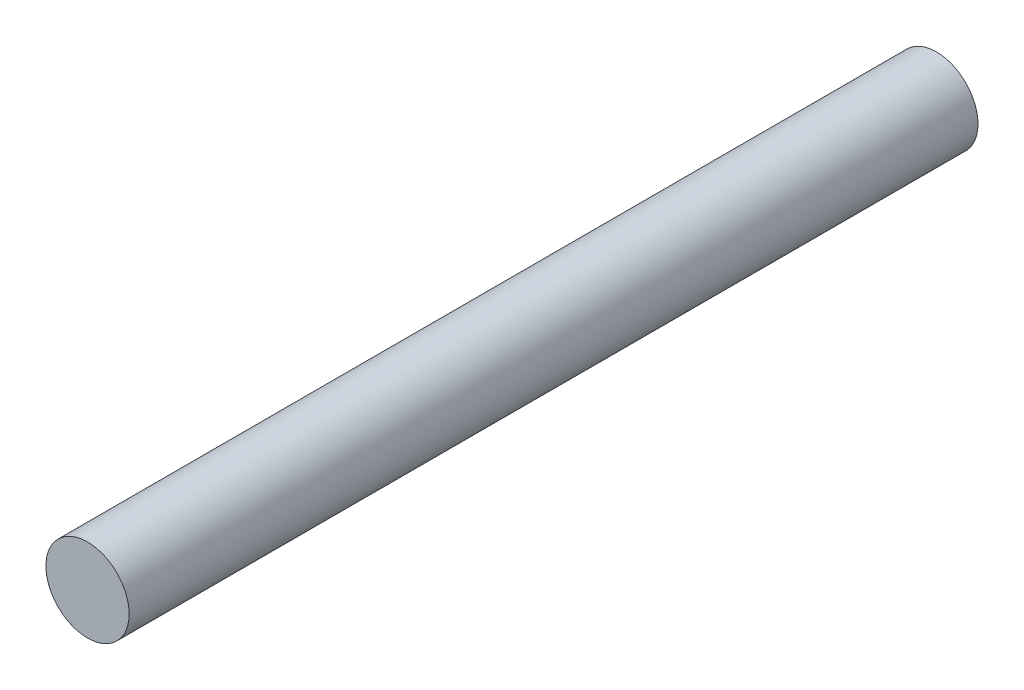
ISO-10303-21;
HEADER;
FILE_DESCRIPTION(('STEP AP214'),'2;1');
FILE_NAME('part.step','',(''),(''),'','','');
FILE_SCHEMA(('AUTOMOTIVE_DESIGN { 1 0 10303 214 1 1 1 1 }'));
ENDSEC;
DATA;
#1=APPLICATION_CONTEXT('core data for automotive mechanical design processes');
#2=APPLICATION_PROTOCOL_DEFINITION('international standard','automotive_design',2000,#1);
#3=PRODUCT_CONTEXT('',#1,'mechanical');
#4=PRODUCT('Part','Part','',(#3));
#5=PRODUCT_RELATED_PRODUCT_CATEGORY('part','',(#4));
#6=PRODUCT_DEFINITION_FORMATION('','',#4);
#7=PRODUCT_DEFINITION_CONTEXT('part definition',#1,'design');
#8=PRODUCT_DEFINITION('design','',#6,#7);
#9=PRODUCT_DEFINITION_SHAPE('','',#8);
#10=(LENGTH_UNIT() NAMED_UNIT(*) SI_UNIT(.MILLI.,.METRE.));
#11=(NAMED_UNIT(*) PLANE_ANGLE_UNIT() SI_UNIT($,.RADIAN.));
#12=(NAMED_UNIT(*) SI_UNIT($,.STERADIAN.) SOLID_ANGLE_UNIT());
#13=UNCERTAINTY_MEASURE_WITH_UNIT(LENGTH_MEASURE(1.E-05),#10,'distance_accuracy_value','');
#14=(GEOMETRIC_REPRESENTATION_CONTEXT(3) GLOBAL_UNCERTAINTY_ASSIGNED_CONTEXT((#13)) GLOBAL_UNIT_ASSIGNED_CONTEXT((#10,
#11,#12)) REPRESENTATION_CONTEXT('',''));
#15=CARTESIAN_POINT('',(0.,0.,0.));
#16=DIRECTION('',(0.,0.,1.));
#17=DIRECTION('',(1.,0.,0.));
#18=AXIS2_PLACEMENT_3D('',#15,#16,#17);
#19=CARTESIAN_POINT('',(0.,0.,204.));
#20=DIRECTION('',(0.,0.,-1.));
#21=DIRECTION('',(-1.,0.,0.));
#22=AXIS2_PLACEMENT_3D('',#19,#20,#21);
#23=CYLINDRICAL_SURFACE('',#22,10.);
#24=CARTESIAN_POINT('',(0.,0.,204.));
#25=DIRECTION('',(0.,0.,1.));
#26=DIRECTION('',(1.,0.,0.));
#27=AXIS2_PLACEMENT_3D('',#24,#25,#26);
#28=CIRCLE('',#27,10.);
#29=CARTESIAN_POINT('',(10.,0.,204.));
#30=VERTEX_POINT('',#29);
#31=EDGE_CURVE('E10',#30,#30,#28,.T.);
#32=ORIENTED_EDGE('',*,*,#31,.F.);
#33=EDGE_LOOP('',(#32));
#34=FACE_BOUND('',#33,.T.);
#35=CARTESIAN_POINT('',(0.,0.,0.));
#36=DIRECTION('',(0.,0.,1.));
#37=DIRECTION('',(1.,0.,0.));
#38=AXIS2_PLACEMENT_3D('',#35,#36,#37);
#39=CIRCLE('',#38,10.);
#40=CARTESIAN_POINT('',(10.,0.,0.));
#41=VERTEX_POINT('',#40);
#42=EDGE_CURVE('E33',#41,#41,#39,.T.);
#43=ORIENTED_EDGE('',*,*,#42,.T.);
#44=EDGE_LOOP('',(#43));
#45=FACE_BOUND('',#44,.T.);
#46=ADVANCED_FACE('F30',(#34,#45),#23,.T.);
#47=CARTESIAN_POINT('',(0.,0.,204.));
#48=DIRECTION('',(0.,0.,1.));
#49=DIRECTION('',(1.,0.,0.));
#50=AXIS2_PLACEMENT_3D('',#47,#48,#49);
#51=PLANE('',#50);
#52=ORIENTED_EDGE('',*,*,#31,.T.);
#53=EDGE_LOOP('',(#52));
#54=FACE_BOUND('',#53,.T.);
#55=ADVANCED_FACE('F45',(#54),#51,.T.);
#56=CARTESIAN_POINT('',(0.,0.,0.));
#57=DIRECTION('',(0.,0.,1.));
#58=DIRECTION('',(1.,0.,0.));
#59=AXIS2_PLACEMENT_3D('',#56,#57,#58);
#60=PLANE('',#59);
#61=ORIENTED_EDGE('',*,*,#42,.F.);
#62=EDGE_LOOP('',(#61));
#63=FACE_BOUND('',#62,.T.);
#64=ADVANCED_FACE('F43',(#63),#60,.F.);
#65=CLOSED_SHELL('',(#46,#55,#64));
#66=MANIFOLD_SOLID_BREP('B2',#65);
#67=ADVANCED_BREP_SHAPE_REPRESENTATION('',(#18,#66),#14);
#68=SHAPE_DEFINITION_REPRESENTATION(#9,#67);
ENDSEC;
END-ISO-10303-21;
